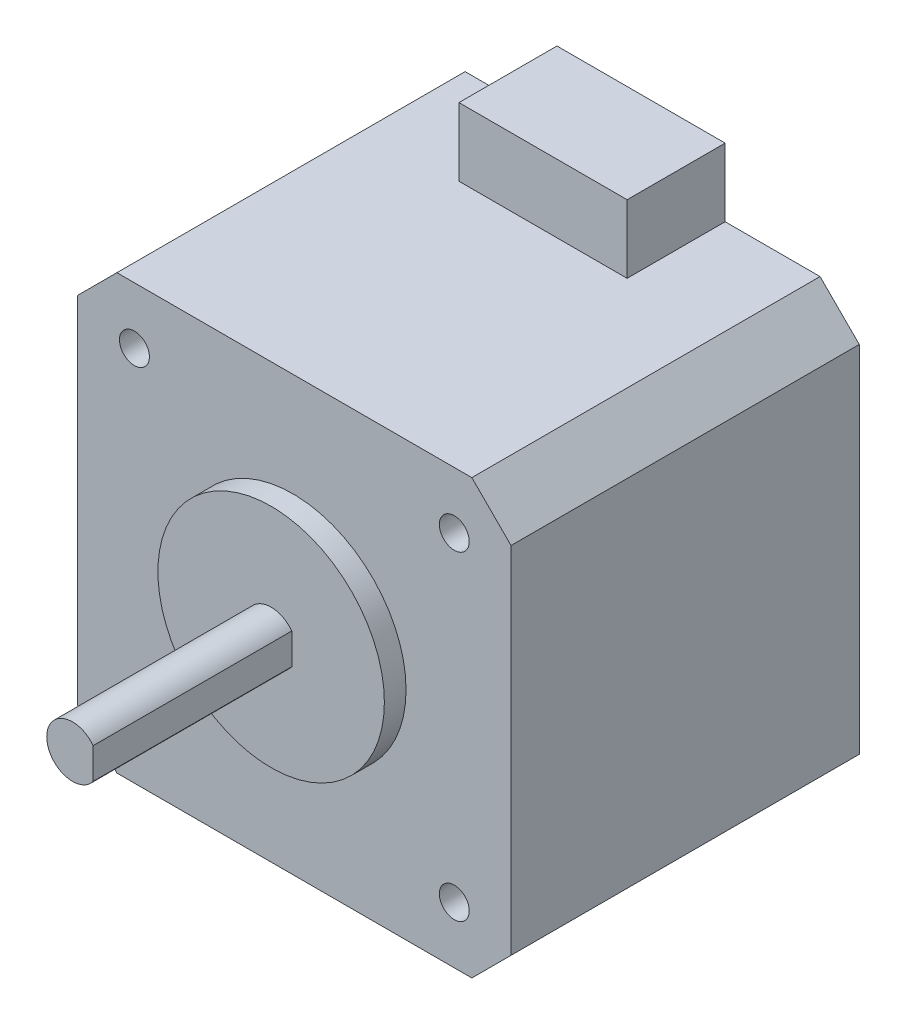
ISO-10303-21;
HEADER;
FILE_DESCRIPTION(('STEP AP214'),'2;1');
FILE_NAME('part.step','',(''),(''),'','','');
FILE_SCHEMA(('AUTOMOTIVE_DESIGN { 1 0 10303 214 1 1 1 1 }'));
ENDSEC;
DATA;
#1=APPLICATION_CONTEXT('core data for automotive mechanical design processes');
#2=APPLICATION_PROTOCOL_DEFINITION('international standard','automotive_design',2000,#1);
#3=PRODUCT_CONTEXT('',#1,'mechanical');
#4=PRODUCT('Part','Part','',(#3));
#5=PRODUCT_RELATED_PRODUCT_CATEGORY('part','',(#4));
#6=PRODUCT_DEFINITION_FORMATION('','',#4);
#7=PRODUCT_DEFINITION_CONTEXT('part definition',#1,'design');
#8=PRODUCT_DEFINITION('design','',#6,#7);
#9=PRODUCT_DEFINITION_SHAPE('','',#8);
#10=(LENGTH_UNIT() NAMED_UNIT(*) SI_UNIT(.MILLI.,.METRE.));
#11=(NAMED_UNIT(*) PLANE_ANGLE_UNIT() SI_UNIT($,.RADIAN.));
#12=(NAMED_UNIT(*) SI_UNIT($,.STERADIAN.) SOLID_ANGLE_UNIT());
#13=UNCERTAINTY_MEASURE_WITH_UNIT(LENGTH_MEASURE(1.E-05),#10,'distance_accuracy_value','');
#14=(GEOMETRIC_REPRESENTATION_CONTEXT(3) GLOBAL_UNCERTAINTY_ASSIGNED_CONTEXT((#13)) GLOBAL_UNIT_ASSIGNED_CONTEXT((#10,
#11,#12)) REPRESENTATION_CONTEXT('',''));
#15=CARTESIAN_POINT('',(0.,0.,0.));
#16=DIRECTION('',(0.,0.,1.));
#17=DIRECTION('',(1.,0.,0.));
#18=AXIS2_PLACEMENT_3D('',#15,#16,#17);
#19=CARTESIAN_POINT('',(0.,0.,33.75));
#20=DIRECTION('',(-1.,0.,0.));
#21=DIRECTION('',(0.,0.,1.));
#22=AXIS2_PLACEMENT_3D('',#19,#20,#21);
#23=PLANE('',#22);
#24=DIRECTION('',(0.,1.,0.));
#25=VECTOR('',#24,1.);
#26=CARTESIAN_POINT('',(0.,0.,0.));
#27=LINE('',#26,#25);
#28=CARTESIAN_POINT('',(0.,3.8,0.));
#29=VERTEX_POINT('',#28);
#30=CARTESIAN_POINT('',(0.,38.2,0.));
#31=VERTEX_POINT('',#30);
#32=EDGE_CURVE('E184',#29,#31,#27,.T.);
#33=ORIENTED_EDGE('',*,*,#32,.F.);
#34=DIRECTION('',(0.,0.,-1.));
#35=VECTOR('',#34,1.);
#36=CARTESIAN_POINT('',(0.,3.8,33.75));
#37=LINE('',#36,#35);
#38=CARTESIAN_POINT('',(0.,3.8,33.75));
#39=VERTEX_POINT('',#38);
#40=EDGE_CURVE('E37',#39,#29,#37,.T.);
#41=ORIENTED_EDGE('',*,*,#40,.F.);
#42=DIRECTION('',(0.,1.,0.));
#43=VECTOR('',#42,1.);
#44=CARTESIAN_POINT('',(0.,0.,33.75));
#45=LINE('',#44,#43);
#46=CARTESIAN_POINT('',(0.,38.2,33.75));
#47=VERTEX_POINT('',#46);
#48=EDGE_CURVE('E185',#39,#47,#45,.T.);
#49=ORIENTED_EDGE('',*,*,#48,.T.);
#50=DIRECTION('',(0.,0.,-1.));
#51=VECTOR('',#50,1.);
#52=CARTESIAN_POINT('',(0.,38.2,33.75));
#53=LINE('',#52,#51);
#54=EDGE_CURVE('E206',#47,#31,#53,.T.);
#55=ORIENTED_EDGE('',*,*,#54,.T.);
#56=EDGE_LOOP('',(#33,#41,#49,#55));
#57=FACE_BOUND('',#56,.T.);
#58=ADVANCED_FACE('F34',(#57),#23,.T.);
#59=CARTESIAN_POINT('',(1.9,1.9,33.75));
#60=DIRECTION('',(0.707106781186547,0.707106781186547,0.));
#61=DIRECTION('',(-0.707106781186548,0.707106781186548,0.));
#62=AXIS2_PLACEMENT_3D('',#59,#60,#61);
#63=PLANE('',#62);
#64=DIRECTION('',(0.707106781186548,-0.707106781186548,0.));
#65=VECTOR('',#64,1.);
#66=CARTESIAN_POINT('',(1.9,1.9,0.));
#67=LINE('',#66,#65);
#68=CARTESIAN_POINT('',(3.8,0.,0.));
#69=VERTEX_POINT('',#68);
#70=EDGE_CURVE('E209',#29,#69,#67,.T.);
#71=ORIENTED_EDGE('',*,*,#70,.T.);
#72=DIRECTION('',(0.,0.,-1.));
#73=VECTOR('',#72,1.);
#74=CARTESIAN_POINT('',(3.8,0.,33.75));
#75=LINE('',#74,#73);
#76=CARTESIAN_POINT('',(3.8,0.,33.75));
#77=VERTEX_POINT('',#76);
#78=EDGE_CURVE('E240',#77,#69,#75,.T.);
#79=ORIENTED_EDGE('',*,*,#78,.F.);
#80=DIRECTION('',(0.707106781186548,-0.707106781186548,0.));
#81=VECTOR('',#80,1.);
#82=CARTESIAN_POINT('',(1.9,1.9,33.75));
#83=LINE('',#82,#81);
#84=EDGE_CURVE('E188',#39,#77,#83,.T.);
#85=ORIENTED_EDGE('',*,*,#84,.F.);
#86=ORIENTED_EDGE('',*,*,#40,.T.);
#87=EDGE_LOOP('',(#71,#79,#85,#86));
#88=FACE_BOUND('',#87,.T.);
#89=ADVANCED_FACE('F249',(#88),#63,.F.);
#90=CARTESIAN_POINT('',(0.,0.,33.75));
#91=DIRECTION('',(0.,1.,0.));
#92=DIRECTION('',(0.,0.,1.));
#93=AXIS2_PLACEMENT_3D('',#90,#91,#92);
#94=PLANE('',#93);
#95=DIRECTION('',(1.,0.,0.));
#96=VECTOR('',#95,1.);
#97=CARTESIAN_POINT('',(0.,0.,0.));
#98=LINE('',#97,#96);
#99=CARTESIAN_POINT('',(38.2,0.,0.));
#100=VERTEX_POINT('',#99);
#101=EDGE_CURVE('E211',#69,#100,#98,.T.);
#102=ORIENTED_EDGE('',*,*,#101,.T.);
#103=DIRECTION('',(0.,0.,-1.));
#104=VECTOR('',#103,1.);
#105=CARTESIAN_POINT('',(38.2,0.,33.75));
#106=LINE('',#105,#104);
#107=CARTESIAN_POINT('',(38.2,0.,33.75));
#108=VERTEX_POINT('',#107);
#109=EDGE_CURVE('E238',#108,#100,#106,.T.);
#110=ORIENTED_EDGE('',*,*,#109,.F.);
#111=DIRECTION('',(1.,0.,0.));
#112=VECTOR('',#111,1.);
#113=CARTESIAN_POINT('',(0.,0.,33.75));
#114=LINE('',#113,#112);
#115=EDGE_CURVE('E191',#77,#108,#114,.T.);
#116=ORIENTED_EDGE('',*,*,#115,.F.);
#117=ORIENTED_EDGE('',*,*,#78,.T.);
#118=EDGE_LOOP('',(#102,#110,#116,#117));
#119=FACE_BOUND('',#118,.T.);
#120=ADVANCED_FACE('F292',(#119),#94,.F.);
#121=CARTESIAN_POINT('',(19.1,-19.1,33.75));
#122=DIRECTION('',(-0.707106781186548,0.707106781186547,0.));
#123=DIRECTION('',(-0.707106781186547,-0.707106781186548,0.));
#124=AXIS2_PLACEMENT_3D('',#121,#122,#123);
#125=PLANE('',#124);
#126=DIRECTION('',(0.707106781186547,0.707106781186548,0.));
#127=VECTOR('',#126,1.);
#128=CARTESIAN_POINT('',(19.1,-19.1,0.));
#129=LINE('',#128,#127);
#130=CARTESIAN_POINT('',(42.,3.8,0.));
#131=VERTEX_POINT('',#130);
#132=EDGE_CURVE('E213',#100,#131,#129,.T.);
#133=ORIENTED_EDGE('',*,*,#132,.T.);
#134=DIRECTION('',(0.,0.,-1.));
#135=VECTOR('',#134,1.);
#136=CARTESIAN_POINT('',(42.,3.8,33.75));
#137=LINE('',#136,#135);
#138=CARTESIAN_POINT('',(42.,3.8,33.75));
#139=VERTEX_POINT('',#138);
#140=EDGE_CURVE('E235',#139,#131,#137,.T.);
#141=ORIENTED_EDGE('',*,*,#140,.F.);
#142=DIRECTION('',(0.707106781186547,0.707106781186548,0.));
#143=VECTOR('',#142,1.);
#144=CARTESIAN_POINT('',(19.1,-19.1,33.75));
#145=LINE('',#144,#143);
#146=EDGE_CURVE('E193',#108,#139,#145,.T.);
#147=ORIENTED_EDGE('',*,*,#146,.F.);
#148=ORIENTED_EDGE('',*,*,#109,.T.);
#149=EDGE_LOOP('',(#133,#141,#147,#148));
#150=FACE_BOUND('',#149,.T.);
#151=ADVANCED_FACE('F290',(#150),#125,.F.);
#152=CARTESIAN_POINT('',(42.,0.,33.75));
#153=DIRECTION('',(-1.,0.,0.));
#154=DIRECTION('',(0.,0.,1.));
#155=AXIS2_PLACEMENT_3D('',#152,#153,#154);
#156=PLANE('',#155);
#157=DIRECTION('',(0.,1.,0.));
#158=VECTOR('',#157,1.);
#159=CARTESIAN_POINT('',(42.,0.,0.));
#160=LINE('',#159,#158);
#161=CARTESIAN_POINT('',(42.,38.2,0.));
#162=VERTEX_POINT('',#161);
#163=EDGE_CURVE('E215',#131,#162,#160,.T.);
#164=ORIENTED_EDGE('',*,*,#163,.T.);
#165=DIRECTION('',(0.,0.,-1.));
#166=VECTOR('',#165,1.);
#167=CARTESIAN_POINT('',(42.,38.2,33.75));
#168=LINE('',#167,#166);
#169=CARTESIAN_POINT('',(42.,38.2,33.75));
#170=VERTEX_POINT('',#169);
#171=EDGE_CURVE('E233',#170,#162,#168,.T.);
#172=ORIENTED_EDGE('',*,*,#171,.F.);
#173=DIRECTION('',(0.,1.,0.));
#174=VECTOR('',#173,1.);
#175=CARTESIAN_POINT('',(42.,0.,33.75));
#176=LINE('',#175,#174);
#177=EDGE_CURVE('E195',#139,#170,#176,.T.);
#178=ORIENTED_EDGE('',*,*,#177,.F.);
#179=ORIENTED_EDGE('',*,*,#140,.T.);
#180=EDGE_LOOP('',(#164,#172,#178,#179));
#181=FACE_BOUND('',#180,.T.);
#182=ADVANCED_FACE('F285',(#181),#156,.F.);
#183=CARTESIAN_POINT('',(40.1,40.1,33.75));
#184=DIRECTION('',(0.707106781186547,0.707106781186547,0.));
#185=DIRECTION('',(-0.707106781186548,0.707106781186548,0.));
#186=AXIS2_PLACEMENT_3D('',#183,#184,#185);
#187=PLANE('',#186);
#188=DIRECTION('',(0.707106781186548,-0.707106781186548,0.));
#189=VECTOR('',#188,1.);
#190=CARTESIAN_POINT('',(40.1,40.1,0.));
#191=LINE('',#190,#189);
#192=CARTESIAN_POINT('',(38.2,42.,0.));
#193=VERTEX_POINT('',#192);
#194=EDGE_CURVE('E218',#193,#162,#191,.T.);
#195=ORIENTED_EDGE('',*,*,#194,.F.);
#196=DIRECTION('',(0.,0.,-1.));
#197=VECTOR('',#196,1.);
#198=CARTESIAN_POINT('',(38.2,42.,33.75));
#199=LINE('',#198,#197);
#200=CARTESIAN_POINT('',(38.2,42.,33.75));
#201=VERTEX_POINT('',#200);
#202=EDGE_CURVE('E230',#201,#193,#199,.T.);
#203=ORIENTED_EDGE('',*,*,#202,.F.);
#204=DIRECTION('',(0.707106781186548,-0.707106781186548,0.));
#205=VECTOR('',#204,1.);
#206=CARTESIAN_POINT('',(40.1,40.1,33.75));
#207=LINE('',#206,#205);
#208=EDGE_CURVE('E197',#201,#170,#207,.T.);
#209=ORIENTED_EDGE('',*,*,#208,.T.);
#210=ORIENTED_EDGE('',*,*,#171,.T.);
#211=EDGE_LOOP('',(#195,#203,#209,#210));
#212=FACE_BOUND('',#211,.T.);
#213=ADVANCED_FACE('F281',(#212),#187,.T.);
#214=CARTESIAN_POINT('',(0.,42.,33.75));
#215=DIRECTION('',(0.,1.,0.));
#216=DIRECTION('',(0.,0.,1.));
#217=AXIS2_PLACEMENT_3D('',#214,#215,#216);
#218=PLANE('',#217);
#219=DIRECTION('',(0.,0.,-1.));
#220=VECTOR('',#219,1.);
#221=CARTESIAN_POINT('',(29.,42.,9.5));
#222=LINE('',#221,#220);
#223=CARTESIAN_POINT('',(29.,42.,9.5));
#224=VERTEX_POINT('',#223);
#225=CARTESIAN_POINT('',(29.,42.,0.));
#226=VERTEX_POINT('',#225);
#227=EDGE_CURVE('E180',#224,#226,#222,.T.);
#228=ORIENTED_EDGE('',*,*,#227,.F.);
#229=DIRECTION('',(1.,0.,0.));
#230=VECTOR('',#229,1.);
#231=CARTESIAN_POINT('',(0.,42.,9.5));
#232=LINE('',#231,#230);
#233=CARTESIAN_POINT('',(12.7,42.,9.5));
#234=VERTEX_POINT('',#233);
#235=EDGE_CURVE('E161',#234,#224,#232,.T.);
#236=ORIENTED_EDGE('',*,*,#235,.F.);
#237=DIRECTION('',(0.,0.,-1.));
#238=VECTOR('',#237,1.);
#239=CARTESIAN_POINT('',(12.7,42.,9.5));
#240=LINE('',#239,#238);
#241=CARTESIAN_POINT('',(12.7,42.,0.));
#242=VERTEX_POINT('',#241);
#243=EDGE_CURVE('E182',#234,#242,#240,.T.);
#244=ORIENTED_EDGE('',*,*,#243,.T.);
#245=DIRECTION('',(1.,0.,0.));
#246=VECTOR('',#245,1.);
#247=CARTESIAN_POINT('',(0.,42.,0.));
#248=LINE('',#247,#246);
#249=CARTESIAN_POINT('',(3.8,42.,0.));
#250=VERTEX_POINT('',#249);
#251=EDGE_CURVE('E222',#250,#242,#248,.T.);
#252=ORIENTED_EDGE('',*,*,#251,.F.);
#253=DIRECTION('',(0.,0.,-1.));
#254=VECTOR('',#253,1.);
#255=CARTESIAN_POINT('',(3.8,42.,33.75));
#256=LINE('',#255,#254);
#257=CARTESIAN_POINT('',(3.8,42.,33.75));
#258=VERTEX_POINT('',#257);
#259=EDGE_CURVE('E228',#258,#250,#256,.T.);
#260=ORIENTED_EDGE('',*,*,#259,.F.);
#261=DIRECTION('',(1.,0.,0.));
#262=VECTOR('',#261,1.);
#263=CARTESIAN_POINT('',(0.,42.,33.75));
#264=LINE('',#263,#262);
#265=EDGE_CURVE('E200',#258,#201,#264,.T.);
#266=ORIENTED_EDGE('',*,*,#265,.T.);
#267=ORIENTED_EDGE('',*,*,#202,.T.);
#268=EDGE_CURVE('E221',#226,#193,#248,.T.);
#269=ORIENTED_EDGE('',*,*,#268,.F.);
#270=EDGE_LOOP('',(#228,#236,#244,#252,#260,#266,#267,#269));
#271=FACE_BOUND('',#270,.T.);
#272=ADVANCED_FACE('F264',(#271),#218,.T.);
#273=CARTESIAN_POINT('',(-19.1,19.1,33.75));
#274=DIRECTION('',(-0.707106781186547,0.707106781186548,0.));
#275=DIRECTION('',(-0.707106781186548,-0.707106781186547,0.));
#276=AXIS2_PLACEMENT_3D('',#273,#274,#275);
#277=PLANE('',#276);
#278=DIRECTION('',(0.707106781186548,0.707106781186547,0.));
#279=VECTOR('',#278,1.);
#280=CARTESIAN_POINT('',(-19.1,19.1,0.));
#281=LINE('',#280,#279);
#282=EDGE_CURVE('E189',#31,#250,#281,.T.);
#283=ORIENTED_EDGE('',*,*,#282,.F.);
#284=ORIENTED_EDGE('',*,*,#54,.F.);
#285=DIRECTION('',(0.707106781186548,0.707106781186547,0.));
#286=VECTOR('',#285,1.);
#287=CARTESIAN_POINT('',(-19.1,19.1,33.75));
#288=LINE('',#287,#286);
#289=EDGE_CURVE('E203',#47,#258,#288,.T.);
#290=ORIENTED_EDGE('',*,*,#289,.T.);
#291=ORIENTED_EDGE('',*,*,#259,.T.);
#292=EDGE_LOOP('',(#283,#284,#290,#291));
#293=FACE_BOUND('',#292,.T.);
#294=ADVANCED_FACE('F259',(#293),#277,.T.);
#295=CARTESIAN_POINT('',(0.,0.,33.75));
#296=DIRECTION('',(0.,0.,1.));
#297=DIRECTION('',(1.,0.,0.));
#298=AXIS2_PLACEMENT_3D('',#295,#296,#297);
#299=PLANE('',#298);
#300=CARTESIAN_POINT('',(36.5,36.5,33.75));
#301=DIRECTION('',(0.,0.,1.));
#302=DIRECTION('',(1.,0.,0.));
#303=AXIS2_PLACEMENT_3D('',#300,#301,#302);
#304=CIRCLE('',#303,1.45);
#305=CARTESIAN_POINT('',(37.95,36.5,33.75));
#306=VERTEX_POINT('',#305);
#307=EDGE_CURVE('E545',#306,#306,#304,.T.);
#308=ORIENTED_EDGE('',*,*,#307,.F.);
#309=EDGE_LOOP('',(#308));
#310=FACE_BOUND('',#309,.T.);
#311=CARTESIAN_POINT('',(5.5,5.50000000000001,33.75));
#312=DIRECTION('',(0.,0.,1.));
#313=DIRECTION('',(1.,0.,0.));
#314=AXIS2_PLACEMENT_3D('',#311,#312,#313);
#315=CIRCLE('',#314,1.45);
#316=CARTESIAN_POINT('',(6.95,5.50000000000001,33.75));
#317=VERTEX_POINT('',#316);
#318=EDGE_CURVE('E559',#317,#317,#315,.T.);
#319=ORIENTED_EDGE('',*,*,#318,.F.);
#320=EDGE_LOOP('',(#319));
#321=FACE_BOUND('',#320,.T.);
#322=CARTESIAN_POINT('',(36.5,5.50000000000001,33.75));
#323=DIRECTION('',(0.,0.,1.));
#324=DIRECTION('',(1.,0.,0.));
#325=AXIS2_PLACEMENT_3D('',#322,#323,#324);
#326=CIRCLE('',#325,1.45);
#327=CARTESIAN_POINT('',(37.95,5.50000000000001,33.75));
#328=VERTEX_POINT('',#327);
#329=EDGE_CURVE('E554',#328,#328,#326,.T.);
#330=ORIENTED_EDGE('',*,*,#329,.F.);
#331=EDGE_LOOP('',(#330));
#332=FACE_BOUND('',#331,.T.);
#333=CARTESIAN_POINT('',(5.5,36.5,33.75));
#334=DIRECTION('',(0.,0.,1.));
#335=DIRECTION('',(1.,0.,0.));
#336=AXIS2_PLACEMENT_3D('',#333,#334,#335);
#337=CIRCLE('',#336,1.45);
#338=CARTESIAN_POINT('',(6.95,36.5,33.75));
#339=VERTEX_POINT('',#338);
#340=EDGE_CURVE('E544',#339,#339,#337,.T.);
#341=ORIENTED_EDGE('',*,*,#340,.F.);
#342=EDGE_LOOP('',(#341));
#343=FACE_BOUND('',#342,.T.);
#344=CARTESIAN_POINT('',(20.85,21.,33.75));
#345=DIRECTION('',(0.,0.,1.));
#346=DIRECTION('',(1.,0.,0.));
#347=AXIS2_PLACEMENT_3D('',#344,#345,#346);
#348=CIRCLE('',#347,10.975);
#349=CARTESIAN_POINT('',(31.825,21.,33.75));
#350=VERTEX_POINT('',#349);
#351=EDGE_CURVE('E11',#350,#350,#348,.T.);
#352=ORIENTED_EDGE('',*,*,#351,.F.);
#353=EDGE_LOOP('',(#352));
#354=FACE_BOUND('',#353,.T.);
#355=ORIENTED_EDGE('',*,*,#48,.F.);
#356=ORIENTED_EDGE('',*,*,#84,.T.);
#357=ORIENTED_EDGE('',*,*,#115,.T.);
#358=ORIENTED_EDGE('',*,*,#146,.T.);
#359=ORIENTED_EDGE('',*,*,#177,.T.);
#360=ORIENTED_EDGE('',*,*,#208,.F.);
#361=ORIENTED_EDGE('',*,*,#265,.F.);
#362=ORIENTED_EDGE('',*,*,#289,.F.);
#363=EDGE_LOOP('',(#355,#356,#357,#358,#359,#360,#361,#362));
#364=FACE_BOUND('',#363,.T.);
#365=ADVANCED_FACE('F294',(#310,#321,#332,#343,#354,#364),#299,.T.);
#366=CARTESIAN_POINT('',(0.,0.,0.));
#367=DIRECTION('',(0.,0.,1.));
#368=DIRECTION('',(1.,0.,0.));
#369=AXIS2_PLACEMENT_3D('',#366,#367,#368);
#370=PLANE('',#369);
#371=ORIENTED_EDGE('',*,*,#32,.T.);
#372=ORIENTED_EDGE('',*,*,#282,.T.);
#373=ORIENTED_EDGE('',*,*,#251,.T.);
#374=DIRECTION('',(0.,1.,0.));
#375=VECTOR('',#374,1.);
#376=CARTESIAN_POINT('',(12.7,0.,0.));
#377=LINE('',#376,#375);
#378=CARTESIAN_POINT('',(12.7,48.6,0.));
#379=VERTEX_POINT('',#378);
#380=EDGE_CURVE('E56',#242,#379,#377,.T.);
#381=ORIENTED_EDGE('',*,*,#380,.T.);
#382=DIRECTION('',(1.,0.,0.));
#383=VECTOR('',#382,1.);
#384=CARTESIAN_POINT('',(0.,48.6,0.));
#385=LINE('',#384,#383);
#386=CARTESIAN_POINT('',(29.,48.6,0.));
#387=VERTEX_POINT('',#386);
#388=EDGE_CURVE('E162',#379,#387,#385,.T.);
#389=ORIENTED_EDGE('',*,*,#388,.T.);
#390=DIRECTION('',(0.,-1.,0.));
#391=VECTOR('',#390,1.);
#392=CARTESIAN_POINT('',(29.,0.,0.));
#393=LINE('',#392,#391);
#394=EDGE_CURVE('E172',#387,#226,#393,.T.);
#395=ORIENTED_EDGE('',*,*,#394,.T.);
#396=ORIENTED_EDGE('',*,*,#268,.T.);
#397=ORIENTED_EDGE('',*,*,#194,.T.);
#398=ORIENTED_EDGE('',*,*,#163,.F.);
#399=ORIENTED_EDGE('',*,*,#132,.F.);
#400=ORIENTED_EDGE('',*,*,#101,.F.);
#401=ORIENTED_EDGE('',*,*,#70,.F.);
#402=EDGE_LOOP('',(#371,#372,#373,#381,#389,#395,#396,#397,#398,#399,#400,#401));
#403=FACE_BOUND('',#402,.T.);
#404=ADVANCED_FACE('F254',(#403),#370,.F.);
#405=CARTESIAN_POINT('',(12.7,0.,9.5));
#406=DIRECTION('',(-1.,0.,0.));
#407=DIRECTION('',(0.,0.,1.));
#408=AXIS2_PLACEMENT_3D('',#405,#406,#407);
#409=PLANE('',#408);
#410=ORIENTED_EDGE('',*,*,#380,.F.);
#411=ORIENTED_EDGE('',*,*,#243,.F.);
#412=DIRECTION('',(0.,1.,0.));
#413=VECTOR('',#412,1.);
#414=CARTESIAN_POINT('',(12.7,0.,9.5));
#415=LINE('',#414,#413);
#416=CARTESIAN_POINT('',(12.7,48.6,9.5));
#417=VERTEX_POINT('',#416);
#418=EDGE_CURVE('E158',#234,#417,#415,.T.);
#419=ORIENTED_EDGE('',*,*,#418,.T.);
#420=DIRECTION('',(0.,0.,-1.));
#421=VECTOR('',#420,1.);
#422=CARTESIAN_POINT('',(12.7,48.6,9.5));
#423=LINE('',#422,#421);
#424=EDGE_CURVE('E170',#417,#379,#423,.T.);
#425=ORIENTED_EDGE('',*,*,#424,.T.);
#426=EDGE_LOOP('',(#410,#411,#419,#425));
#427=FACE_BOUND('',#426,.T.);
#428=ADVANCED_FACE('F268',(#427),#409,.T.);
#429=CARTESIAN_POINT('',(29.,0.,9.5));
#430=DIRECTION('',(1.,0.,0.));
#431=DIRECTION('',(0.,0.,-1.));
#432=AXIS2_PLACEMENT_3D('',#429,#430,#431);
#433=PLANE('',#432);
#434=ORIENTED_EDGE('',*,*,#394,.F.);
#435=DIRECTION('',(0.,0.,-1.));
#436=VECTOR('',#435,1.);
#437=CARTESIAN_POINT('',(29.,48.6,9.5));
#438=LINE('',#437,#436);
#439=CARTESIAN_POINT('',(29.,48.6,9.5));
#440=VERTEX_POINT('',#439);
#441=EDGE_CURVE('E178',#440,#387,#438,.T.);
#442=ORIENTED_EDGE('',*,*,#441,.F.);
#443=DIRECTION('',(0.,-1.,0.));
#444=VECTOR('',#443,1.);
#445=CARTESIAN_POINT('',(29.,0.,9.5));
#446=LINE('',#445,#444);
#447=EDGE_CURVE('E164',#440,#224,#446,.T.);
#448=ORIENTED_EDGE('',*,*,#447,.T.);
#449=ORIENTED_EDGE('',*,*,#227,.T.);
#450=EDGE_LOOP('',(#434,#442,#448,#449));
#451=FACE_BOUND('',#450,.T.);
#452=ADVANCED_FACE('F393',(#451),#433,.T.);
#453=CARTESIAN_POINT('',(0.,48.6,9.5));
#454=DIRECTION('',(0.,1.,0.));
#455=DIRECTION('',(0.,0.,1.));
#456=AXIS2_PLACEMENT_3D('',#453,#454,#455);
#457=PLANE('',#456);
#458=ORIENTED_EDGE('',*,*,#388,.F.);
#459=ORIENTED_EDGE('',*,*,#424,.F.);
#460=DIRECTION('',(1.,0.,0.));
#461=VECTOR('',#460,1.);
#462=CARTESIAN_POINT('',(0.,48.6,9.5));
#463=LINE('',#462,#461);
#464=EDGE_CURVE('E167',#417,#440,#463,.T.);
#465=ORIENTED_EDGE('',*,*,#464,.T.);
#466=ORIENTED_EDGE('',*,*,#441,.T.);
#467=EDGE_LOOP('',(#458,#459,#465,#466));
#468=FACE_BOUND('',#467,.T.);
#469=ADVANCED_FACE('F274',(#468),#457,.T.);
#470=CARTESIAN_POINT('',(0.,0.,9.5));
#471=DIRECTION('',(0.,0.,1.));
#472=DIRECTION('',(1.,0.,0.));
#473=AXIS2_PLACEMENT_3D('',#470,#471,#472);
#474=PLANE('',#473);
#475=ORIENTED_EDGE('',*,*,#418,.F.);
#476=ORIENTED_EDGE('',*,*,#235,.T.);
#477=ORIENTED_EDGE('',*,*,#447,.F.);
#478=ORIENTED_EDGE('',*,*,#464,.F.);
#479=EDGE_LOOP('',(#475,#476,#477,#478));
#480=FACE_BOUND('',#479,.T.);
#481=ADVANCED_FACE('F271',(#480),#474,.T.);
#482=CARTESIAN_POINT('',(20.85,21.,35.85));
#483=DIRECTION('',(0.,0.,-1.));
#484=DIRECTION('',(-1.,0.,0.));
#485=AXIS2_PLACEMENT_3D('',#482,#483,#484);
#486=CYLINDRICAL_SURFACE('',#485,10.975);
#487=CARTESIAN_POINT('',(20.85,21.,35.85));
#488=DIRECTION('',(0.,0.,1.));
#489=DIRECTION('',(1.,0.,0.));
#490=AXIS2_PLACEMENT_3D('',#487,#488,#489);
#491=CIRCLE('',#490,10.975);
#492=CARTESIAN_POINT('',(31.825,21.,35.85));
#493=VERTEX_POINT('',#492);
#494=EDGE_CURVE('E151',#493,#493,#491,.T.);
#495=ORIENTED_EDGE('',*,*,#494,.F.);
#496=EDGE_LOOP('',(#495));
#497=FACE_BOUND('',#496,.T.);
#498=ORIENTED_EDGE('',*,*,#351,.T.);
#499=EDGE_LOOP('',(#498));
#500=FACE_BOUND('',#499,.T.);
#501=ADVANCED_FACE('F414',(#497,#500),#486,.T.);
#502=CARTESIAN_POINT('',(20.85,21.,35.85));
#503=DIRECTION('',(0.,0.,1.));
#504=DIRECTION('',(1.,0.,0.));
#505=AXIS2_PLACEMENT_3D('',#502,#503,#504);
#506=PLANE('',#505);
#507=CARTESIAN_POINT('',(20.85,21.,35.85));
#508=DIRECTION('',(0.,0.,1.));
#509=DIRECTION('',(1.,0.,0.));
#510=AXIS2_PLACEMENT_3D('',#507,#508,#509);
#511=CIRCLE('',#510,2.5);
#512=CARTESIAN_POINT('',(22.85,22.5,35.85));
#513=VERTEX_POINT('',#512);
#514=CARTESIAN_POINT('',(22.85,19.5,35.85));
#515=VERTEX_POINT('',#514);
#516=EDGE_CURVE('E150',#513,#515,#511,.T.);
#517=ORIENTED_EDGE('',*,*,#516,.F.);
#518=DIRECTION('',(0.,1.,0.));
#519=VECTOR('',#518,1.);
#520=CARTESIAN_POINT('',(22.85,22.5,35.85));
#521=LINE('',#520,#519);
#522=EDGE_CURVE('E48',#515,#513,#521,.T.);
#523=ORIENTED_EDGE('',*,*,#522,.F.);
#524=EDGE_LOOP('',(#517,#523));
#525=FACE_BOUND('',#524,.T.);
#526=ORIENTED_EDGE('',*,*,#494,.T.);
#527=EDGE_LOOP('',(#526));
#528=FACE_BOUND('',#527,.T.);
#529=ADVANCED_FACE('F422',(#525,#528),#506,.T.);
#530=CARTESIAN_POINT('',(20.85,21.,55.1));
#531=DIRECTION('',(0.,0.,-1.));
#532=DIRECTION('',(-1.,0.,0.));
#533=AXIS2_PLACEMENT_3D('',#530,#531,#532);
#534=CYLINDRICAL_SURFACE('',#533,2.5);
#535=ORIENTED_EDGE('',*,*,#516,.T.);
#536=DIRECTION('',(0.,0.,-1.));
#537=VECTOR('',#536,1.);
#538=CARTESIAN_POINT('',(22.85,19.5,55.1));
#539=LINE('',#538,#537);
#540=CARTESIAN_POINT('',(22.85,19.5,55.1));
#541=VERTEX_POINT('',#540);
#542=EDGE_CURVE('E138',#541,#515,#539,.T.);
#543=ORIENTED_EDGE('',*,*,#542,.F.);
#544=CARTESIAN_POINT('',(20.85,21.,55.1));
#545=DIRECTION('',(0.,0.,1.));
#546=DIRECTION('',(1.,0.,0.));
#547=AXIS2_PLACEMENT_3D('',#544,#545,#546);
#548=CIRCLE('',#547,2.5);
#549=CARTESIAN_POINT('',(22.85,22.5,55.1));
#550=VERTEX_POINT('',#549);
#551=EDGE_CURVE('E144',#550,#541,#548,.T.);
#552=ORIENTED_EDGE('',*,*,#551,.F.);
#553=DIRECTION('',(0.,0.,-1.));
#554=VECTOR('',#553,1.);
#555=CARTESIAN_POINT('',(22.85,22.5,55.1));
#556=LINE('',#555,#554);
#557=EDGE_CURVE('E141',#550,#513,#556,.T.);
#558=ORIENTED_EDGE('',*,*,#557,.T.);
#559=EDGE_LOOP('',(#535,#543,#552,#558));
#560=FACE_BOUND('',#559,.T.);
#561=ADVANCED_FACE('F149',(#560),#534,.T.);
#562=CARTESIAN_POINT('',(22.85,22.5,55.1));
#563=DIRECTION('',(-1.,0.,0.));
#564=DIRECTION('',(0.,-1.,0.));
#565=AXIS2_PLACEMENT_3D('',#562,#563,#564);
#566=PLANE('',#565);
#567=ORIENTED_EDGE('',*,*,#522,.T.);
#568=ORIENTED_EDGE('',*,*,#557,.F.);
#569=DIRECTION('',(0.,1.,0.));
#570=VECTOR('',#569,1.);
#571=CARTESIAN_POINT('',(22.85,22.5,55.1));
#572=LINE('',#571,#570);
#573=EDGE_CURVE('E134',#541,#550,#572,.T.);
#574=ORIENTED_EDGE('',*,*,#573,.F.);
#575=ORIENTED_EDGE('',*,*,#542,.T.);
#576=EDGE_LOOP('',(#567,#568,#574,#575));
#577=FACE_BOUND('',#576,.T.);
#578=ADVANCED_FACE('F136',(#577),#566,.F.);
#579=CARTESIAN_POINT('',(20.85,21.,55.1));
#580=DIRECTION('',(0.,0.,1.));
#581=DIRECTION('',(1.,0.,0.));
#582=AXIS2_PLACEMENT_3D('',#579,#580,#581);
#583=PLANE('',#582);
#584=ORIENTED_EDGE('',*,*,#551,.T.);
#585=ORIENTED_EDGE('',*,*,#573,.T.);
#586=EDGE_LOOP('',(#584,#585));
#587=FACE_BOUND('',#586,.T.);
#588=ADVANCED_FACE('F146',(#587),#583,.T.);
#589=CARTESIAN_POINT('',(5.5,36.5,29.25));
#590=DIRECTION('',(0.,0.,1.));
#591=DIRECTION('',(1.,0.,0.));
#592=AXIS2_PLACEMENT_3D('',#589,#590,#591);
#593=CYLINDRICAL_SURFACE('',#592,1.45);
#594=CARTESIAN_POINT('',(5.5,36.5,29.25));
#595=DIRECTION('',(0.,0.,1.));
#596=DIRECTION('',(1.,0.,0.));
#597=AXIS2_PLACEMENT_3D('',#594,#595,#596);
#598=CIRCLE('',#597,1.45);
#599=CARTESIAN_POINT('',(6.95,36.5,29.25));
#600=VERTEX_POINT('',#599);
#601=EDGE_CURVE('E548',#600,#600,#598,.T.);
#602=ORIENTED_EDGE('',*,*,#601,.F.);
#603=EDGE_LOOP('',(#602));
#604=FACE_BOUND('',#603,.T.);
#605=ORIENTED_EDGE('',*,*,#340,.T.);
#606=EDGE_LOOP('',(#605));
#607=FACE_BOUND('',#606,.T.);
#608=ADVANCED_FACE('F451',(#604,#607),#593,.F.);
#609=CARTESIAN_POINT('',(5.5,36.5,29.25));
#610=DIRECTION('',(0.,0.,1.));
#611=DIRECTION('',(1.,0.,0.));
#612=AXIS2_PLACEMENT_3D('',#609,#610,#611);
#613=PLANE('',#612);
#614=ORIENTED_EDGE('',*,*,#601,.T.);
#615=EDGE_LOOP('',(#614));
#616=FACE_BOUND('',#615,.T.);
#617=ADVANCED_FACE('F458',(#616),#613,.T.);
#618=CARTESIAN_POINT('',(36.5,5.50000000000001,29.25));
#619=DIRECTION('',(0.,0.,1.));
#620=DIRECTION('',(1.,0.,0.));
#621=AXIS2_PLACEMENT_3D('',#618,#619,#620);
#622=CYLINDRICAL_SURFACE('',#621,1.45);
#623=CARTESIAN_POINT('',(36.5,5.50000000000001,29.25));
#624=DIRECTION('',(0.,0.,1.));
#625=DIRECTION('',(1.,0.,0.));
#626=AXIS2_PLACEMENT_3D('',#623,#624,#625);
#627=CIRCLE('',#626,1.45);
#628=CARTESIAN_POINT('',(37.95,5.50000000000001,29.25));
#629=VERTEX_POINT('',#628);
#630=EDGE_CURVE('E562',#629,#629,#627,.T.);
#631=ORIENTED_EDGE('',*,*,#630,.F.);
#632=EDGE_LOOP('',(#631));
#633=FACE_BOUND('',#632,.T.);
#634=ORIENTED_EDGE('',*,*,#329,.T.);
#635=EDGE_LOOP('',(#634));
#636=FACE_BOUND('',#635,.T.);
#637=ADVANCED_FACE('F467',(#633,#636),#622,.F.);
#638=CARTESIAN_POINT('',(36.5,5.50000000000001,29.25));
#639=DIRECTION('',(0.,0.,1.));
#640=DIRECTION('',(1.,0.,0.));
#641=AXIS2_PLACEMENT_3D('',#638,#639,#640);
#642=PLANE('',#641);
#643=ORIENTED_EDGE('',*,*,#630,.T.);
#644=EDGE_LOOP('',(#643));
#645=FACE_BOUND('',#644,.T.);
#646=ADVANCED_FACE('F476',(#645),#642,.T.);
#647=CARTESIAN_POINT('',(5.5,5.50000000000001,29.25));
#648=DIRECTION('',(0.,0.,1.));
#649=DIRECTION('',(1.,0.,0.));
#650=AXIS2_PLACEMENT_3D('',#647,#648,#649);
#651=CYLINDRICAL_SURFACE('',#650,1.45);
#652=CARTESIAN_POINT('',(5.5,5.50000000000001,29.25));
#653=DIRECTION('',(0.,0.,1.));
#654=DIRECTION('',(1.,0.,0.));
#655=AXIS2_PLACEMENT_3D('',#652,#653,#654);
#656=CIRCLE('',#655,1.45);
#657=CARTESIAN_POINT('',(6.95,5.50000000000001,29.25));
#658=VERTEX_POINT('',#657);
#659=EDGE_CURVE('E551',#658,#658,#656,.T.);
#660=ORIENTED_EDGE('',*,*,#659,.F.);
#661=EDGE_LOOP('',(#660));
#662=FACE_BOUND('',#661,.T.);
#663=ORIENTED_EDGE('',*,*,#318,.T.);
#664=EDGE_LOOP('',(#663));
#665=FACE_BOUND('',#664,.T.);
#666=ADVANCED_FACE('F485',(#662,#665),#651,.F.);
#667=CARTESIAN_POINT('',(5.5,5.50000000000001,29.25));
#668=DIRECTION('',(0.,0.,1.));
#669=DIRECTION('',(1.,0.,0.));
#670=AXIS2_PLACEMENT_3D('',#667,#668,#669);
#671=PLANE('',#670);
#672=ORIENTED_EDGE('',*,*,#659,.T.);
#673=EDGE_LOOP('',(#672));
#674=FACE_BOUND('',#673,.T.);
#675=ADVANCED_FACE('F494',(#674),#671,.T.);
#676=CARTESIAN_POINT('',(36.5,36.5,29.25));
#677=DIRECTION('',(0.,0.,1.));
#678=DIRECTION('',(1.,0.,0.));
#679=AXIS2_PLACEMENT_3D('',#676,#677,#678);
#680=CYLINDRICAL_SURFACE('',#679,1.45);
#681=CARTESIAN_POINT('',(36.5,36.5,29.25));
#682=DIRECTION('',(0.,0.,1.));
#683=DIRECTION('',(1.,0.,0.));
#684=AXIS2_PLACEMENT_3D('',#681,#682,#683);
#685=CIRCLE('',#684,1.45);
#686=CARTESIAN_POINT('',(37.95,36.5,29.25));
#687=VERTEX_POINT('',#686);
#688=EDGE_CURVE('E543',#687,#687,#685,.T.);
#689=ORIENTED_EDGE('',*,*,#688,.F.);
#690=EDGE_LOOP('',(#689));
#691=FACE_BOUND('',#690,.T.);
#692=ORIENTED_EDGE('',*,*,#307,.T.);
#693=EDGE_LOOP('',(#692));
#694=FACE_BOUND('',#693,.T.);
#695=ADVANCED_FACE('F503',(#691,#694),#680,.F.);
#696=CARTESIAN_POINT('',(36.5,36.5,29.25));
#697=DIRECTION('',(0.,0.,1.));
#698=DIRECTION('',(1.,0.,0.));
#699=AXIS2_PLACEMENT_3D('',#696,#697,#698);
#700=PLANE('',#699);
#701=ORIENTED_EDGE('',*,*,#688,.T.);
#702=EDGE_LOOP('',(#701));
#703=FACE_BOUND('',#702,.T.);
#704=ADVANCED_FACE('F512',(#703),#700,.T.);
#705=CLOSED_SHELL('',(#58,#89,#120,#151,#182,#213,#272,#294,#365,#404,#428,#452,#469,#481,#501,
#529,#561,#578,#588,#608,#617,#637,#646,#666,#675,#695,#704));
#706=MANIFOLD_SOLID_BREP('B2',#705);
#707=ADVANCED_BREP_SHAPE_REPRESENTATION('',(#18,#706),#14);
#708=SHAPE_DEFINITION_REPRESENTATION(#9,#707);
ENDSEC;
END-ISO-10303-21;
